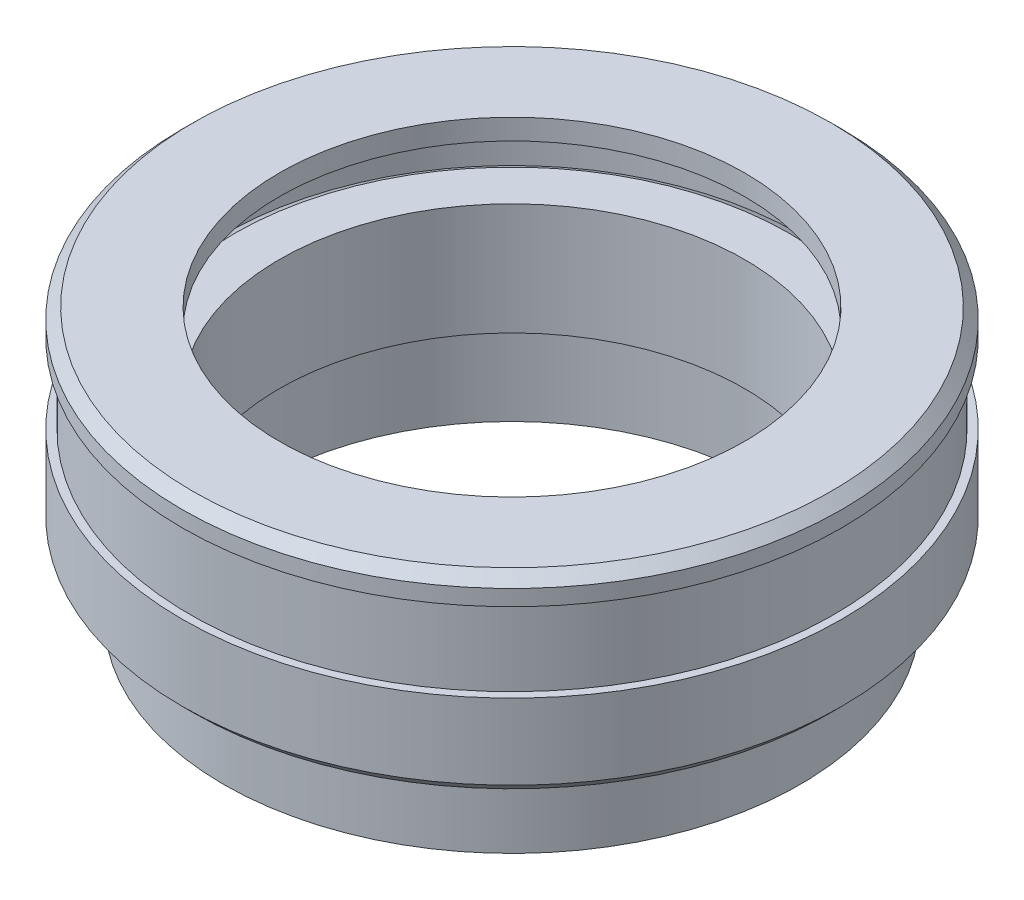
ISO-10303-21;
HEADER;
FILE_DESCRIPTION(('STEP AP214'),'2;1');
FILE_NAME('part.step','',(''),(''),'','','');
FILE_SCHEMA(('AUTOMOTIVE_DESIGN { 1 0 10303 214 1 1 1 1 }'));
ENDSEC;
DATA;
#1=APPLICATION_CONTEXT('core data for automotive mechanical design processes');
#2=APPLICATION_PROTOCOL_DEFINITION('international standard','automotive_design',2000,#1);
#3=PRODUCT_CONTEXT('',#1,'mechanical');
#4=PRODUCT('Part','Part','',(#3));
#5=PRODUCT_RELATED_PRODUCT_CATEGORY('part','',(#4));
#6=PRODUCT_DEFINITION_FORMATION('','',#4);
#7=PRODUCT_DEFINITION_CONTEXT('part definition',#1,'design');
#8=PRODUCT_DEFINITION('design','',#6,#7);
#9=PRODUCT_DEFINITION_SHAPE('','',#8);
#10=(LENGTH_UNIT() NAMED_UNIT(*) SI_UNIT(.MILLI.,.METRE.));
#11=(NAMED_UNIT(*) PLANE_ANGLE_UNIT() SI_UNIT($,.RADIAN.));
#12=(NAMED_UNIT(*) SI_UNIT($,.STERADIAN.) SOLID_ANGLE_UNIT());
#13=UNCERTAINTY_MEASURE_WITH_UNIT(LENGTH_MEASURE(1.E-05),#10,'distance_accuracy_value','');
#14=(GEOMETRIC_REPRESENTATION_CONTEXT(3) GLOBAL_UNCERTAINTY_ASSIGNED_CONTEXT((#13)) GLOBAL_UNIT_ASSIGNED_CONTEXT((#10,
#11,#12)) REPRESENTATION_CONTEXT('',''));
#15=CARTESIAN_POINT('',(0.,0.,0.));
#16=DIRECTION('',(0.,0.,1.));
#17=DIRECTION('',(1.,0.,0.));
#18=AXIS2_PLACEMENT_3D('',#15,#16,#17);
#19=CARTESIAN_POINT('',(-8.60589324580831,-12.2043791852345,8.19905806889665));
#20=DIRECTION('',(0.,-1.,0.));
#21=DIRECTION('',(0.,0.,-1.));
#22=AXIS2_PLACEMENT_3D('',#19,#20,#21);
#23=PLANE('',#22);
#24=CARTESIAN_POINT('',(7.0786067541917,-12.2043791852345,8.19905806889665));
#25=DIRECTION('',(0.,-1.,0.));
#26=DIRECTION('',(0.,0.,-1.));
#27=AXIS2_PLACEMENT_3D('',#24,#25,#26);
#28=CIRCLE('',#27,15.494);
#29=CARTESIAN_POINT('',(7.0786067541917,-12.2043791852345,-7.29494193110335));
#30=VERTEX_POINT('',#29);
#31=EDGE_CURVE('P0_E50',#30,#30,#28,.T.);
#32=ORIENTED_EDGE('',*,*,#31,.F.);
#33=EDGE_LOOP('',(#32));
#34=FACE_BOUND('',#33,.T.);
#35=CARTESIAN_POINT('',(7.0786067541917,-12.2043791852345,8.19905806889665));
#36=DIRECTION('',(0.,-1.,0.));
#37=DIRECTION('',(0.,0.,-1.));
#38=AXIS2_PLACEMENT_3D('',#35,#36,#37);
#39=CIRCLE('',#38,15.875);
#40=CARTESIAN_POINT('',(7.0786067541917,-12.2043791852345,-7.67594193110335));
#41=VERTEX_POINT('',#40);
#42=EDGE_CURVE('P0_E17',#41,#41,#39,.F.);
#43=ORIENTED_EDGE('',*,*,#42,.F.);
#44=EDGE_LOOP('',(#43));
#45=FACE_BOUND('',#44,.T.);
#46=ADVANCED_FACE('P0_F14',(#34,#45),#23,.T.);
#47=CARTESIAN_POINT('',(7.0786067541917,-11.5693791852345,8.19905806889665));
#48=DIRECTION('',(0.,-1.,0.));
#49=DIRECTION('',(0.,0.,-1.));
#50=AXIS2_PLACEMENT_3D('',#47,#48,#49);
#51=CYLINDRICAL_SURFACE('',#50,15.875);
#52=CARTESIAN_POINT('',(7.0786067541917,-11.4423791854625,8.19905806889665));
#53=DIRECTION('',(0.,-1.,0.));
#54=DIRECTION('',(1.,0.,0.));
#55=AXIS2_PLACEMENT_3D('',#52,#53,#54);
#56=CIRCLE('',#55,15.874999999772);
#57=CARTESIAN_POINT('',(22.9536067539637,-11.4423791854625,8.19905806889665));
#58=VERTEX_POINT('',#57);
#59=EDGE_CURVE('P0_E49',#58,#58,#56,.F.);
#60=ORIENTED_EDGE('',*,*,#59,.F.);
#61=EDGE_LOOP('',(#60));
#62=FACE_BOUND('',#61,.T.);
#63=ORIENTED_EDGE('',*,*,#42,.T.);
#64=EDGE_LOOP('',(#63));
#65=FACE_BOUND('',#64,.T.);
#66=ADVANCED_FACE('P0_F58',(#62,#65),#51,.T.);
#67=CARTESIAN_POINT('',(7.0786067541917,-14.1093791852346,8.19905806889665));
#68=DIRECTION('',(0.,-1.,0.));
#69=DIRECTION('',(0.,0.,-1.));
#70=AXIS2_PLACEMENT_3D('',#67,#68,#69);
#71=CYLINDRICAL_SURFACE('',#70,15.494);
#72=ORIENTED_EDGE('',*,*,#31,.T.);
#73=EDGE_LOOP('',(#72));
#74=FACE_BOUND('',#73,.T.);
#75=CARTESIAN_POINT('',(7.0786067541917,-16.0143791852346,8.19905806889665));
#76=DIRECTION('',(0.,-1.,0.));
#77=DIRECTION('',(0.,0.,-1.));
#78=AXIS2_PLACEMENT_3D('',#75,#76,#77);
#79=CIRCLE('',#78,15.494);
#80=CARTESIAN_POINT('',(7.0786067541917,-16.0143791852346,-7.29494193110335));
#81=VERTEX_POINT('',#80);
#82=EDGE_CURVE('P0_E47',#81,#81,#79,.T.);
#83=ORIENTED_EDGE('',*,*,#82,.F.);
#84=EDGE_LOOP('',(#83));
#85=FACE_BOUND('',#84,.T.);
#86=ADVANCED_FACE('P0_F66',(#74,#85),#71,.T.);
#87=CARTESIAN_POINT('',(7.0786067541917,-11.4423791854625,8.19905806889665));
#88=DIRECTION('',(0.,-1.,0.));
#89=DIRECTION('',(0.,0.,-1.));
#90=AXIS2_PLACEMENT_3D('',#87,#88,#89);
#91=CONICAL_SURFACE('',#90,15.874999999772,0.785398162499999);
#92=ORIENTED_EDGE('',*,*,#59,.T.);
#93=EDGE_LOOP('',(#92));
#94=FACE_BOUND('',#93,.T.);
#95=CARTESIAN_POINT('',(7.0786067541917,-10.9343791850066,8.19905806889665));
#96=DIRECTION('',(0.,-1.,0.));
#97=DIRECTION('',(0.,0.,-1.));
#98=AXIS2_PLACEMENT_3D('',#95,#96,#97);
#99=CIRCLE('',#98,15.367000000228);
#100=CARTESIAN_POINT('',(7.0786067541917,-10.9343791850066,-7.16794193133131));
#101=VERTEX_POINT('',#100);
#102=EDGE_CURVE('P0_E44',#101,#101,#99,.F.);
#103=ORIENTED_EDGE('',*,*,#102,.F.);
#104=EDGE_LOOP('',(#103));
#105=FACE_BOUND('',#104,.T.);
#106=ADVANCED_FACE('P0_F102',(#94,#105),#91,.T.);
#107=CARTESIAN_POINT('',(-8.60589324580831,-16.0143791852346,8.19905806889665));
#108=DIRECTION('',(0.,1.,0.));
#109=DIRECTION('',(0.,0.,1.));
#110=AXIS2_PLACEMENT_3D('',#107,#108,#109);
#111=PLANE('',#110);
#112=ORIENTED_EDGE('',*,*,#82,.T.);
#113=EDGE_LOOP('',(#112));
#114=FACE_BOUND('',#113,.T.);
#115=CARTESIAN_POINT('',(7.0786067541917,-16.0143791852346,8.19905806889665));
#116=DIRECTION('',(0.,-1.,0.));
#117=DIRECTION('',(0.,0.,-1.));
#118=AXIS2_PLACEMENT_3D('',#115,#116,#117);
#119=CIRCLE('',#118,15.875);
#120=CARTESIAN_POINT('',(7.0786067541917,-16.0143791852346,-7.67594193110335));
#121=VERTEX_POINT('',#120);
#122=EDGE_CURVE('P0_E41',#121,#121,#119,.T.);
#123=ORIENTED_EDGE('',*,*,#122,.F.);
#124=EDGE_LOOP('',(#123));
#125=FACE_BOUND('',#124,.T.);
#126=ADVANCED_FACE('P0_F98',(#114,#125),#111,.T.);
#127=CARTESIAN_POINT('',(-6.45959324580831,-10.9343791852345,8.19905806889665));
#128=DIRECTION('',(0.,1.,0.));
#129=DIRECTION('',(0.,0.,1.));
#130=AXIS2_PLACEMENT_3D('',#127,#128,#129);
#131=PLANE('',#130);
#132=CARTESIAN_POINT('',(7.0786067541917,-10.9343791852345,8.19905806889665));
#133=DIRECTION('',(0.,-1.,0.));
#134=DIRECTION('',(0.,0.,-1.));
#135=AXIS2_PLACEMENT_3D('',#132,#133,#134);
#136=CIRCLE('',#135,11.2014);
#137=CARTESIAN_POINT('',(7.0786067541917,-10.9343791852345,-3.00234193110335));
#138=VERTEX_POINT('',#137);
#139=EDGE_CURVE('P0_E38',#138,#138,#136,.T.);
#140=ORIENTED_EDGE('',*,*,#139,.T.);
#141=EDGE_LOOP('',(#140));
#142=FACE_BOUND('',#141,.T.);
#143=ORIENTED_EDGE('',*,*,#102,.T.);
#144=EDGE_LOOP('',(#143));
#145=FACE_BOUND('',#144,.T.);
#146=ADVANCED_FACE('P0_F94',(#142,#145),#131,.T.);
#147=CARTESIAN_POINT('',(7.0786067541917,-18.0844791852345,8.19905806889665));
#148=DIRECTION('',(0.,-1.,0.));
#149=DIRECTION('',(0.,0.,-1.));
#150=AXIS2_PLACEMENT_3D('',#147,#148,#149);
#151=CYLINDRICAL_SURFACE('',#150,15.875);
#152=CARTESIAN_POINT('',(7.0786067541917,-19.6465791850066,8.19905806889665));
#153=DIRECTION('',(0.,1.,0.));
#154=DIRECTION('',(1.,0.,0.));
#155=AXIS2_PLACEMENT_3D('',#152,#153,#154);
#156=CIRCLE('',#155,15.874999999772);
#157=CARTESIAN_POINT('',(22.9536067539637,-19.6465791850066,8.19905806889665));
#158=VERTEX_POINT('',#157);
#159=EDGE_CURVE('P0_E37',#158,#158,#156,.F.);
#160=ORIENTED_EDGE('',*,*,#159,.F.);
#161=EDGE_LOOP('',(#160));
#162=FACE_BOUND('',#161,.T.);
#163=ORIENTED_EDGE('',*,*,#122,.T.);
#164=EDGE_LOOP('',(#163));
#165=FACE_BOUND('',#164,.T.);
#166=ADVANCED_FACE('P0_F90',(#162,#165),#151,.T.);
#167=CARTESIAN_POINT('',(7.0786067541917,-11.4296791852345,8.19905806889665));
#168=DIRECTION('',(0.,-1.,0.));
#169=DIRECTION('',(0.,0.,-1.));
#170=AXIS2_PLACEMENT_3D('',#167,#168,#169);
#171=CYLINDRICAL_SURFACE('',#170,11.2014);
#172=CARTESIAN_POINT('',(7.0786067541917,-11.9249791852345,8.19905806889665));
#173=DIRECTION('',(0.,-1.,0.));
#174=DIRECTION('',(0.,0.,-1.));
#175=AXIS2_PLACEMENT_3D('',#172,#173,#174);
#176=CIRCLE('',#175,11.2014);
#177=CARTESIAN_POINT('',(7.0786067541917,-11.9249791852345,-3.00234193110335));
#178=VERTEX_POINT('',#177);
#179=EDGE_CURVE('P0_E34',#178,#178,#176,.F.);
#180=ORIENTED_EDGE('',*,*,#179,.F.);
#181=EDGE_LOOP('',(#180));
#182=FACE_BOUND('',#181,.T.);
#183=ORIENTED_EDGE('',*,*,#139,.F.);
#184=EDGE_LOOP('',(#183));
#185=FACE_BOUND('',#184,.T.);
#186=ADVANCED_FACE('P0_F86',(#182,#185),#171,.F.);
#187=CARTESIAN_POINT('',(7.0786067541917,-19.6465791850066,8.19905806889665));
#188=DIRECTION('',(0.,1.,0.));
#189=DIRECTION('',(0.,0.,1.));
#190=AXIS2_PLACEMENT_3D('',#187,#188,#189);
#191=CONICAL_SURFACE('',#190,15.874999999772,0.785398162499999);
#192=CARTESIAN_POINT('',(7.0786067541917,-20.1545791854625,8.19905806889665));
#193=DIRECTION('',(0.,1.,0.));
#194=DIRECTION('',(0.,0.,1.));
#195=AXIS2_PLACEMENT_3D('',#192,#193,#194);
#196=CIRCLE('',#195,15.367000000228);
#197=CARTESIAN_POINT('',(7.0786067541917,-20.1545791854625,23.5660580691246));
#198=VERTEX_POINT('',#197);
#199=EDGE_CURVE('P0_E26',#198,#198,#196,.F.);
#200=ORIENTED_EDGE('',*,*,#199,.F.);
#201=EDGE_LOOP('',(#200));
#202=FACE_BOUND('',#201,.T.);
#203=ORIENTED_EDGE('',*,*,#159,.T.);
#204=EDGE_LOOP('',(#203));
#205=FACE_BOUND('',#204,.T.);
#206=ADVANCED_FACE('P0_F82',(#202,#205),#191,.T.);
#207=CARTESIAN_POINT('',(-5.46264324580831,-11.9249791852345,8.19905806889665));
#208=DIRECTION('',(0.,-1.,0.));
#209=DIRECTION('',(0.,0.,-1.));
#210=AXIS2_PLACEMENT_3D('',#207,#208,#209);
#211=PLANE('',#210);
#212=ORIENTED_EDGE('',*,*,#179,.T.);
#213=EDGE_LOOP('',(#212));
#214=FACE_BOUND('',#213,.T.);
#215=CARTESIAN_POINT('',(7.0786067541917,-11.9249791852345,8.19905806889665));
#216=DIRECTION('',(0.,-1.,0.));
#217=DIRECTION('',(0.,0.,-1.));
#218=AXIS2_PLACEMENT_3D('',#215,#216,#217);
#219=CIRCLE('',#218,13.8811);
#220=CARTESIAN_POINT('',(7.0786067541917,-11.9249791852345,-5.68204193110335));
#221=VERTEX_POINT('',#220);
#222=EDGE_CURVE('P0_E21',#221,#221,#219,.T.);
#223=ORIENTED_EDGE('',*,*,#222,.T.);
#224=EDGE_LOOP('',(#223));
#225=FACE_BOUND('',#224,.T.);
#226=ADVANCED_FACE('P0_F76',(#214,#225),#211,.T.);
#227=CARTESIAN_POINT('',(-7.79944324580831,-20.1545791852345,8.19905806889665));
#228=DIRECTION('',(0.,-1.,0.));
#229=DIRECTION('',(0.,0.,-1.));
#230=AXIS2_PLACEMENT_3D('',#227,#228,#229);
#231=PLANE('',#230);
#232=CARTESIAN_POINT('',(7.0786067541917,-20.1545791852345,8.19905806889665));
#233=DIRECTION('',(0.,-1.,0.));
#234=DIRECTION('',(0.,0.,-1.));
#235=AXIS2_PLACEMENT_3D('',#232,#233,#234);
#236=CIRCLE('',#235,13.8811);
#237=CARTESIAN_POINT('',(7.0786067541917,-20.1545791852345,-5.68204193110335));
#238=VERTEX_POINT('',#237);
#239=EDGE_CURVE('P0_E10',#238,#238,#236,.F.);
#240=ORIENTED_EDGE('',*,*,#239,.T.);
#241=EDGE_LOOP('',(#240));
#242=FACE_BOUND('',#241,.T.);
#243=ORIENTED_EDGE('',*,*,#199,.T.);
#244=EDGE_LOOP('',(#243));
#245=FACE_BOUND('',#244,.T.);
#246=ADVANCED_FACE('P0_F70',(#242,#245),#231,.T.);
#247=CARTESIAN_POINT('',(7.0786067541917,-16.0397791852346,8.19905806889665));
#248=DIRECTION('',(0.,-1.,0.));
#249=DIRECTION('',(0.,0.,-1.));
#250=AXIS2_PLACEMENT_3D('',#247,#248,#249);
#251=CYLINDRICAL_SURFACE('',#250,13.8811);
#252=ORIENTED_EDGE('',*,*,#239,.F.);
#253=EDGE_LOOP('',(#252));
#254=FACE_BOUND('',#253,.T.);
#255=ORIENTED_EDGE('',*,*,#222,.F.);
#256=EDGE_LOOP('',(#255));
#257=FACE_BOUND('',#256,.T.);
#258=ADVANCED_FACE('P0_F68',(#254,#257),#251,.F.);
#259=CLOSED_SHELL('',(#46,#66,#86,#106,#126,#146,#166,#186,#206,#226,#246,#258));
#260=MANIFOLD_SOLID_BREP('P0_B1',#259);
#261=CARTESIAN_POINT('',(18.6864067541917,-19.9311898289247,8.19905806889665));
#262=DIRECTION('',(0.,-1.,0.));
#263=DIRECTION('',(0.,0.,-1.));
#264=AXIS2_PLACEMENT_3D('',#261,#262,#263);
#265=PLANE('',#264);
#266=CARTESIAN_POINT('',(7.0786067541917,-19.9311898289247,8.19905806889665));
#267=DIRECTION('',(0.,1.,0.));
#268=DIRECTION('',(0.,0.,1.));
#269=AXIS2_PLACEMENT_3D('',#266,#267,#268);
#270=CIRCLE('',#269,11.2014);
#271=CARTESIAN_POINT('',(7.07860675419169,-19.9311898289247,19.4004580688966));
#272=VERTEX_POINT('',#271);
#273=EDGE_CURVE('P1_E16',#272,#272,#270,.T.);
#274=ORIENTED_EDGE('',*,*,#273,.T.);
#275=EDGE_LOOP('',(#274));
#276=FACE_BOUND('',#275,.T.);
#277=CARTESIAN_POINT('',(7.0786067541917,-19.9311898289247,8.19905806889665));
#278=DIRECTION('',(0.,1.,0.));
#279=DIRECTION('',(0.,0.,1.));
#280=AXIS2_PLACEMENT_3D('',#277,#278,#279);
#281=CIRCLE('',#280,12.0142);
#282=CARTESIAN_POINT('',(7.07860675419169,-19.9311898289247,20.2132580688966));
#283=VERTEX_POINT('',#282);
#284=EDGE_CURVE('P1_E42',#283,#283,#281,.F.);
#285=ORIENTED_EDGE('',*,*,#284,.T.);
#286=EDGE_LOOP('',(#285));
#287=FACE_BOUND('',#286,.T.);
#288=ADVANCED_FACE('P1_F13',(#276,#287),#265,.T.);
#289=CARTESIAN_POINT('',(7.0786067541917,-17.2387898289247,8.19905806889665));
#290=DIRECTION('',(0.,1.,0.));
#291=DIRECTION('',(0.,0.,1.));
#292=AXIS2_PLACEMENT_3D('',#289,#290,#291);
#293=CYLINDRICAL_SURFACE('',#292,11.2014);
#294=CARTESIAN_POINT('',(7.0786067541917,-14.5463898289247,8.19905806889665));
#295=DIRECTION('',(0.,1.,0.));
#296=DIRECTION('',(0.,0.,1.));
#297=AXIS2_PLACEMENT_3D('',#294,#295,#296);
#298=CIRCLE('',#297,11.2014);
#299=CARTESIAN_POINT('',(7.07860675419169,-14.5463898289247,19.4004580688966));
#300=VERTEX_POINT('',#299);
#301=EDGE_CURVE('P1_E40',#300,#300,#298,.F.);
#302=ORIENTED_EDGE('',*,*,#301,.F.);
#303=EDGE_LOOP('',(#302));
#304=FACE_BOUND('',#303,.T.);
#305=ORIENTED_EDGE('',*,*,#273,.F.);
#306=EDGE_LOOP('',(#305));
#307=FACE_BOUND('',#306,.T.);
#308=ADVANCED_FACE('P1_F50',(#304,#307),#293,.F.);
#309=CARTESIAN_POINT('',(7.0786067541917,-22.0647898289247,8.19905806889665));
#310=DIRECTION('',(0.,1.,0.));
#311=DIRECTION('',(0.,0.,1.));
#312=AXIS2_PLACEMENT_3D('',#309,#310,#311);
#313=CYLINDRICAL_SURFACE('',#312,12.0142);
#314=ORIENTED_EDGE('',*,*,#284,.F.);
#315=EDGE_LOOP('',(#314));
#316=FACE_BOUND('',#315,.T.);
#317=CARTESIAN_POINT('',(7.07860675419169,-24.1983898289247,8.19905806889665));
#318=DIRECTION('',(0.,1.,0.));
#319=DIRECTION('',(0.,0.,1.));
#320=AXIS2_PLACEMENT_3D('',#317,#318,#319);
#321=CIRCLE('',#320,12.0142);
#322=CARTESIAN_POINT('',(7.07860675419169,-24.1983898289247,20.2132580688966));
#323=VERTEX_POINT('',#322);
#324=EDGE_CURVE('P1_E37',#323,#323,#321,.T.);
#325=ORIENTED_EDGE('',*,*,#324,.F.);
#326=EDGE_LOOP('',(#325));
#327=FACE_BOUND('',#326,.T.);
#328=ADVANCED_FACE('P1_F52',(#316,#327),#313,.F.);
#329=CARTESIAN_POINT('',(19.3620467541917,-14.5463898289247,8.19905806889665));
#330=DIRECTION('',(0.,1.,0.));
#331=DIRECTION('',(0.,0.,1.));
#332=AXIS2_PLACEMENT_3D('',#329,#330,#331);
#333=PLANE('',#332);
#334=ORIENTED_EDGE('',*,*,#301,.T.);
#335=EDGE_LOOP('',(#334));
#336=FACE_BOUND('',#335,.T.);
#337=CARTESIAN_POINT('',(7.0786067541917,-14.5463898286162,8.19905806889665));
#338=DIRECTION('',(0.,-1.,0.));
#339=DIRECTION('',(0.,0.,-1.));
#340=AXIS2_PLACEMENT_3D('',#337,#338,#339);
#341=CIRCLE('',#340,13.3654800001781);
#342=CARTESIAN_POINT('',(7.0786067541917,-14.5463898286162,-5.16642193128146));
#343=VERTEX_POINT('',#342);
#344=EDGE_CURVE('P1_E34',#343,#343,#341,.T.);
#345=ORIENTED_EDGE('',*,*,#344,.F.);
#346=EDGE_LOOP('',(#345));
#347=FACE_BOUND('',#346,.T.);
#348=ADVANCED_FACE('P1_F59',(#336,#347),#333,.T.);
#349=CARTESIAN_POINT('',(19.7684467541917,-24.1983898289247,8.19905806889665));
#350=DIRECTION('',(0.,-1.,0.));
#351=DIRECTION('',(0.,0.,-1.));
#352=AXIS2_PLACEMENT_3D('',#349,#350,#351);
#353=PLANE('',#352);
#354=ORIENTED_EDGE('',*,*,#324,.T.);
#355=EDGE_LOOP('',(#354));
#356=FACE_BOUND('',#355,.T.);
#357=CARTESIAN_POINT('',(7.07860675419169,-24.1983898292332,8.19905806889665));
#358=DIRECTION('',(0.,1.,0.));
#359=DIRECTION('',(0.,0.,1.));
#360=AXIS2_PLACEMENT_3D('',#357,#358,#359);
#361=CIRCLE('',#360,13.3654800001781);
#362=CARTESIAN_POINT('',(7.07860675419169,-24.1983898292332,21.5645380690748));
#363=VERTEX_POINT('',#362);
#364=EDGE_CURVE('P1_E25',#363,#363,#361,.T.);
#365=ORIENTED_EDGE('',*,*,#364,.F.);
#366=EDGE_LOOP('',(#365));
#367=FACE_BOUND('',#366,.T.);
#368=ADVANCED_FACE('P1_F77',(#356,#367),#353,.T.);
#369=CARTESIAN_POINT('',(7.0786067541917,-14.8440831750327,8.19905806889665));
#370=DIRECTION('',(0.,-1.,0.));
#371=DIRECTION('',(0.,0.,-1.));
#372=AXIS2_PLACEMENT_3D('',#369,#370,#371);
#373=CONICAL_SURFACE('',#372,13.8810999998219,1.04719755);
#374=CARTESIAN_POINT('',(7.0786067541917,-14.8440831747242,8.19905806889665));
#375=DIRECTION('',(0.,1.,0.));
#376=DIRECTION('',(0.,0.,1.));
#377=AXIS2_PLACEMENT_3D('',#374,#375,#376);
#378=CIRCLE('',#377,13.8811);
#379=CARTESIAN_POINT('',(7.07860675419169,-14.8440831747242,22.0801580688966));
#380=VERTEX_POINT('',#379);
#381=EDGE_CURVE('P1_E20',#380,#380,#378,.F.);
#382=ORIENTED_EDGE('',*,*,#381,.F.);
#383=EDGE_LOOP('',(#382));
#384=FACE_BOUND('',#383,.T.);
#385=ORIENTED_EDGE('',*,*,#344,.T.);
#386=EDGE_LOOP('',(#385));
#387=FACE_BOUND('',#386,.T.);
#388=ADVANCED_FACE('P1_F70',(#384,#387),#373,.T.);
#389=CARTESIAN_POINT('',(7.07860675419169,-23.9006964828166,8.19905806889665));
#390=DIRECTION('',(0.,1.,0.));
#391=DIRECTION('',(0.,0.,1.));
#392=AXIS2_PLACEMENT_3D('',#389,#390,#391);
#393=CONICAL_SURFACE('',#392,13.8810999998219,1.04719755);
#394=ORIENTED_EDGE('',*,*,#364,.T.);
#395=EDGE_LOOP('',(#394));
#396=FACE_BOUND('',#395,.T.);
#397=CARTESIAN_POINT('',(7.07860675419169,-23.9006964831252,8.19905806889665));
#398=DIRECTION('',(0.,1.,0.));
#399=DIRECTION('',(0.,0.,1.));
#400=AXIS2_PLACEMENT_3D('',#397,#398,#399);
#401=CIRCLE('',#400,13.8811);
#402=CARTESIAN_POINT('',(7.07860675419169,-23.9006964831252,22.0801580688966));
#403=VERTEX_POINT('',#402);
#404=EDGE_CURVE('P1_E9',#403,#403,#401,.T.);
#405=ORIENTED_EDGE('',*,*,#404,.F.);
#406=EDGE_LOOP('',(#405));
#407=FACE_BOUND('',#406,.T.);
#408=ADVANCED_FACE('P1_F65',(#396,#407),#393,.T.);
#409=CARTESIAN_POINT('',(7.0786067541917,-19.3723898289247,8.19905806889665));
#410=DIRECTION('',(0.,1.,0.));
#411=DIRECTION('',(0.,0.,1.));
#412=AXIS2_PLACEMENT_3D('',#409,#410,#411);
#413=CYLINDRICAL_SURFACE('',#412,13.8811);
#414=ORIENTED_EDGE('',*,*,#404,.T.);
#415=EDGE_LOOP('',(#414));
#416=FACE_BOUND('',#415,.T.);
#417=ORIENTED_EDGE('',*,*,#381,.T.);
#418=EDGE_LOOP('',(#417));
#419=FACE_BOUND('',#418,.T.);
#420=ADVANCED_FACE('P1_F63',(#416,#419),#413,.T.);
#421=CLOSED_SHELL('',(#288,#308,#328,#348,#368,#388,#408,#420));
#422=MANIFOLD_SOLID_BREP('P1_B1',#421);
#423=ADVANCED_BREP_SHAPE_REPRESENTATION('',(#18,#260,#422),#14);
#424=SHAPE_DEFINITION_REPRESENTATION(#9,#423);
ENDSEC;
END-ISO-10303-21;
